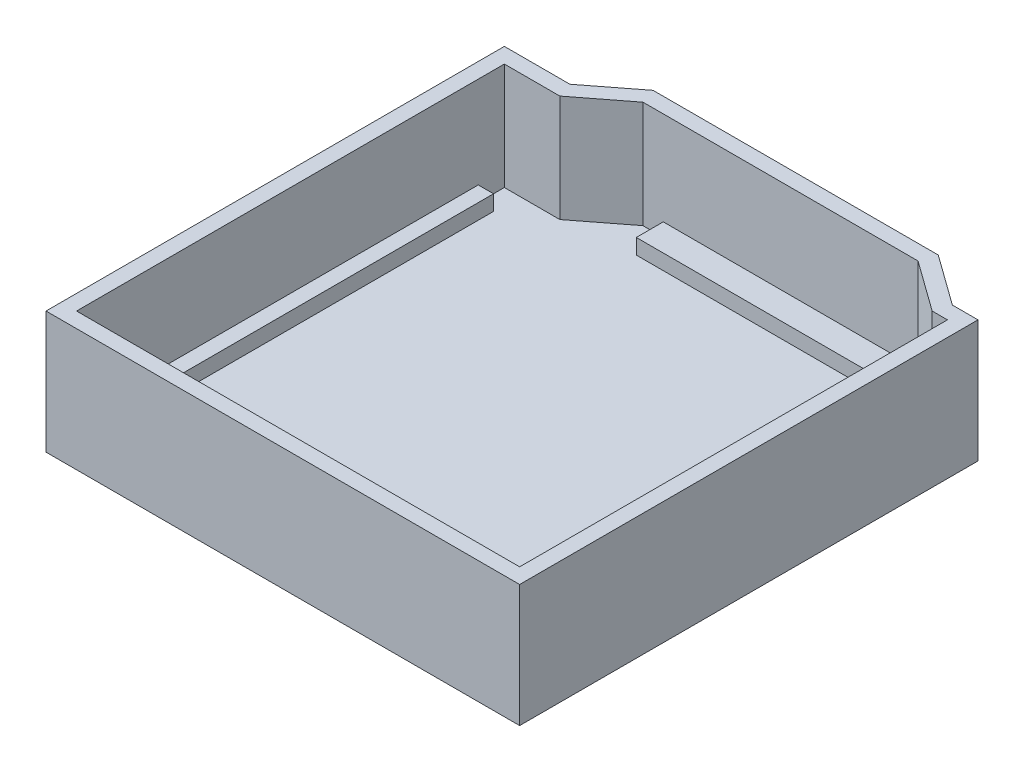
ISO-10303-21;
HEADER;
FILE_DESCRIPTION(('STEP AP214'),'2;1');
FILE_NAME('part.step','',(''),(''),'','','');
FILE_SCHEMA(('AUTOMOTIVE_DESIGN { 1 0 10303 214 1 1 1 1 }'));
ENDSEC;
DATA;
#1=APPLICATION_CONTEXT('core data for automotive mechanical design processes');
#2=APPLICATION_PROTOCOL_DEFINITION('international standard','automotive_design',2000,#1);
#3=PRODUCT_CONTEXT('',#1,'mechanical');
#4=PRODUCT('Part','Part','',(#3));
#5=PRODUCT_RELATED_PRODUCT_CATEGORY('part','',(#4));
#6=PRODUCT_DEFINITION_FORMATION('','',#4);
#7=PRODUCT_DEFINITION_CONTEXT('part definition',#1,'design');
#8=PRODUCT_DEFINITION('design','',#6,#7);
#9=PRODUCT_DEFINITION_SHAPE('','',#8);
#10=(LENGTH_UNIT() NAMED_UNIT(*) SI_UNIT(.MILLI.,.METRE.));
#11=(NAMED_UNIT(*) PLANE_ANGLE_UNIT() SI_UNIT($,.RADIAN.));
#12=(NAMED_UNIT(*) SI_UNIT($,.STERADIAN.) SOLID_ANGLE_UNIT());
#13=UNCERTAINTY_MEASURE_WITH_UNIT(LENGTH_MEASURE(1.E-05),#10,'distance_accuracy_value','');
#14=(GEOMETRIC_REPRESENTATION_CONTEXT(3) GLOBAL_UNCERTAINTY_ASSIGNED_CONTEXT((#13)) GLOBAL_UNIT_ASSIGNED_CONTEXT((#10,
#11,#12)) REPRESENTATION_CONTEXT('',''));
#15=CARTESIAN_POINT('',(0.,0.,0.));
#16=DIRECTION('',(0.,0.,1.));
#17=DIRECTION('',(1.,0.,0.));
#18=AXIS2_PLACEMENT_3D('',#15,#16,#17);
#19=CARTESIAN_POINT('',(0.,0.,0.));
#20=DIRECTION('',(0.,1.,0.));
#21=DIRECTION('',(0.,0.,1.));
#22=AXIS2_PLACEMENT_3D('',#19,#20,#21);
#23=PLANE('',#22);
#24=DIRECTION('',(0.,0.,-1.));
#25=VECTOR('',#24,1.);
#26=CARTESIAN_POINT('',(2.,0.,-52.5835309196684));
#27=LINE('',#26,#25);
#28=CARTESIAN_POINT('',(2.,0.,-2.58353091966845));
#29=VERTEX_POINT('',#28);
#30=CARTESIAN_POINT('',(2.,0.,-52.5835309196684));
#31=VERTEX_POINT('',#30);
#32=EDGE_CURVE('E318',#29,#31,#27,.T.);
#33=ORIENTED_EDGE('',*,*,#32,.F.);
#34=DIRECTION('',(1.,0.,0.));
#35=VECTOR('',#34,1.);
#36=CARTESIAN_POINT('',(0.,0.,-2.58353091966845));
#37=LINE('',#36,#35);
#38=CARTESIAN_POINT('',(0.,0.,-2.58353091966845));
#39=VERTEX_POINT('',#38);
#40=EDGE_CURVE('E300',#39,#29,#37,.T.);
#41=ORIENTED_EDGE('',*,*,#40,.F.);
#42=DIRECTION('',(0.,0.,1.));
#43=VECTOR('',#42,1.);
#44=CARTESIAN_POINT('',(0.,0.,0.));
#45=LINE('',#44,#43);
#46=CARTESIAN_POINT('',(0.,0.,0.));
#47=VERTEX_POINT('',#46);
#48=EDGE_CURVE('E386',#39,#47,#45,.T.);
#49=ORIENTED_EDGE('',*,*,#48,.T.);
#50=DIRECTION('',(1.,0.,0.));
#51=VECTOR('',#50,1.);
#52=CARTESIAN_POINT('',(0.,0.,0.));
#53=LINE('',#52,#51);
#54=CARTESIAN_POINT('',(58.,0.,0.));
#55=VERTEX_POINT('',#54);
#56=EDGE_CURVE('E337',#47,#55,#53,.T.);
#57=ORIENTED_EDGE('',*,*,#56,.T.);
#58=DIRECTION('',(0.,0.,-1.));
#59=VECTOR('',#58,1.);
#60=CARTESIAN_POINT('',(58.,0.,0.));
#61=LINE('',#60,#59);
#62=CARTESIAN_POINT('',(58.,0.,-56.));
#63=VERTEX_POINT('',#62);
#64=EDGE_CURVE('E368',#55,#63,#61,.T.);
#65=ORIENTED_EDGE('',*,*,#64,.T.);
#66=DIRECTION('',(-1.,0.,0.));
#67=VECTOR('',#66,1.);
#68=CARTESIAN_POINT('',(58.,0.,-56.));
#69=LINE('',#68,#67);
#70=CARTESIAN_POINT('',(56.,0.,-56.));
#71=VERTEX_POINT('',#70);
#72=EDGE_CURVE('E371',#63,#71,#69,.T.);
#73=ORIENTED_EDGE('',*,*,#72,.T.);
#74=DIRECTION('',(-0.811665069362016,0.,-0.584123116455386));
#75=VECTOR('',#74,1.);
#76=CARTESIAN_POINT('',(56.,0.,-56.));
#77=LINE('',#76,#75);
#78=CARTESIAN_POINT('',(49.3993617057769,0.,-60.7502172466864));
#79=VERTEX_POINT('',#78);
#80=EDGE_CURVE('E374',#71,#79,#77,.T.);
#81=ORIENTED_EDGE('',*,*,#80,.T.);
#82=DIRECTION('',(-1.,0.,0.));
#83=VECTOR('',#82,1.);
#84=CARTESIAN_POINT('',(13.3993617057769,0.,-60.7502172466864));
#85=LINE('',#84,#83);
#86=CARTESIAN_POINT('',(13.3993617057769,0.,-60.7502172466864));
#87=VERTEX_POINT('',#86);
#88=EDGE_CURVE('E377',#79,#87,#85,.T.);
#89=ORIENTED_EDGE('',*,*,#88,.T.);
#90=DIRECTION('',(-0.790872388544756,0.,0.611981098594976));
#91=VECTOR('',#90,1.);
#92=CARTESIAN_POINT('',(7.26058443206945,0.,-56.));
#93=LINE('',#92,#91);
#94=CARTESIAN_POINT('',(7.26058443206945,0.,-56.));
#95=VERTEX_POINT('',#94);
#96=EDGE_CURVE('E380',#87,#95,#93,.T.);
#97=ORIENTED_EDGE('',*,*,#96,.T.);
#98=DIRECTION('',(-1.,0.,0.));
#99=VECTOR('',#98,1.);
#100=CARTESIAN_POINT('',(0.,0.,-56.));
#101=LINE('',#100,#99);
#102=CARTESIAN_POINT('',(0.,0.,-56.));
#103=VERTEX_POINT('',#102);
#104=EDGE_CURVE('E383',#95,#103,#101,.T.);
#105=ORIENTED_EDGE('',*,*,#104,.T.);
#106=CARTESIAN_POINT('',(0.,0.,-52.5835309196685));
#107=VERTEX_POINT('',#106);
#108=EDGE_CURVE('E342',#103,#107,#45,.T.);
#109=ORIENTED_EDGE('',*,*,#108,.T.);
#110=DIRECTION('',(-1.,0.,0.));
#111=VECTOR('',#110,1.);
#112=CARTESIAN_POINT('',(0.,0.,-52.5835309196685));
#113=LINE('',#112,#111);
#114=EDGE_CURVE('E306',#31,#107,#113,.T.);
#115=ORIENTED_EDGE('',*,*,#114,.F.);
#116=EDGE_LOOP('',(#33,#41,#49,#57,#65,#73,#81,#89,#97,#105,#109,#115));
#117=FACE_BOUND('',#116,.T.);
#118=DIRECTION('',(-1.,0.,0.));
#119=VECTOR('',#118,1.);
#120=CARTESIAN_POINT('',(57.8762424768267,0.,-52.5835309196685));
#121=LINE('',#120,#119);
#122=CARTESIAN_POINT('',(57.8762424768267,0.,-52.5835309196685));
#123=VERTEX_POINT('',#122);
#124=CARTESIAN_POINT('',(56.061719763789,0.,-52.5835309196685));
#125=VERTEX_POINT('',#124);
#126=EDGE_CURVE('E261',#123,#125,#121,.T.);
#127=ORIENTED_EDGE('',*,*,#126,.F.);
#128=DIRECTION('',(0.,0.,-1.));
#129=VECTOR('',#128,1.);
#130=CARTESIAN_POINT('',(57.8762424768267,0.,-52.5835309196685));
#131=LINE('',#130,#129);
#132=CARTESIAN_POINT('',(57.8762424768267,0.,-2.58353091966845));
#133=VERTEX_POINT('',#132);
#134=EDGE_CURVE('E256',#133,#123,#131,.T.);
#135=ORIENTED_EDGE('',*,*,#134,.F.);
#136=DIRECTION('',(1.,0.,0.));
#137=VECTOR('',#136,1.);
#138=CARTESIAN_POINT('',(57.8762424768267,0.,-2.58353091966845));
#139=LINE('',#138,#137);
#140=CARTESIAN_POINT('',(56.061719763789,0.,-2.58353091966845));
#141=VERTEX_POINT('',#140);
#142=EDGE_CURVE('E271',#141,#133,#139,.T.);
#143=ORIENTED_EDGE('',*,*,#142,.F.);
#144=DIRECTION('',(0.,0.,1.));
#145=VECTOR('',#144,1.);
#146=CARTESIAN_POINT('',(56.061719763789,0.,-52.5835309196685));
#147=LINE('',#146,#145);
#148=EDGE_CURVE('E283',#125,#141,#147,.T.);
#149=ORIENTED_EDGE('',*,*,#148,.F.);
#150=EDGE_LOOP('',(#127,#135,#143,#149));
#151=FACE_BOUND('',#150,.T.);
#152=DIRECTION('',(1.,0.,0.));
#153=VECTOR('',#152,1.);
#154=CARTESIAN_POINT('',(16.2938215085871,0.,-56.9762594390906));
#155=LINE('',#154,#153);
#156=CARTESIAN_POINT('',(16.2938215085871,0.,-56.9762594390906));
#157=VERTEX_POINT('',#156);
#158=CARTESIAN_POINT('',(47.311437609835,0.,-56.9762594390906));
#159=VERTEX_POINT('',#158);
#160=EDGE_CURVE('E805',#157,#159,#155,.T.);
#161=ORIENTED_EDGE('',*,*,#160,.F.);
#162=DIRECTION('',(0.,0.,1.));
#163=VECTOR('',#162,1.);
#164=CARTESIAN_POINT('',(16.2938215085871,0.,-60.5067198083384));
#165=LINE('',#164,#163);
#166=CARTESIAN_POINT('',(16.2938215085871,0.,-60.5067198083384));
#167=VERTEX_POINT('',#166);
#168=EDGE_CURVE('E253',#167,#157,#165,.T.);
#169=ORIENTED_EDGE('',*,*,#168,.F.);
#170=DIRECTION('',(-1.,0.,0.));
#171=VECTOR('',#170,1.);
#172=CARTESIAN_POINT('',(16.2938215085871,0.,-60.5067198083384));
#173=LINE('',#172,#171);
#174=CARTESIAN_POINT('',(47.311437609835,0.,-60.5067198083384));
#175=VERTEX_POINT('',#174);
#176=EDGE_CURVE('E249',#175,#167,#173,.T.);
#177=ORIENTED_EDGE('',*,*,#176,.F.);
#178=DIRECTION('',(0.,0.,-1.));
#179=VECTOR('',#178,1.);
#180=CARTESIAN_POINT('',(47.311437609835,0.,-60.5067198083384));
#181=LINE('',#180,#179);
#182=EDGE_CURVE('E801',#159,#175,#181,.T.);
#183=ORIENTED_EDGE('',*,*,#182,.F.);
#184=EDGE_LOOP('',(#161,#169,#177,#183));
#185=FACE_BOUND('',#184,.T.);
#186=ADVANCED_FACE('F39',(#117,#151,#185),#23,.T.);
#187=CARTESIAN_POINT('',(0.,14.,0.));
#188=DIRECTION('',(1.,0.,0.));
#189=DIRECTION('',(0.,0.,-1.));
#190=AXIS2_PLACEMENT_3D('',#187,#188,#189);
#191=PLANE('',#190);
#192=ORIENTED_EDGE('',*,*,#48,.F.);
#193=DIRECTION('',(0.,-1.,0.));
#194=VECTOR('',#193,1.);
#195=CARTESIAN_POINT('',(0.,2.,-2.58353091966845));
#196=LINE('',#195,#194);
#197=CARTESIAN_POINT('',(0.,2.,-2.58353091966845));
#198=VERTEX_POINT('',#197);
#199=EDGE_CURVE('E334',#198,#39,#196,.T.);
#200=ORIENTED_EDGE('',*,*,#199,.F.);
#201=DIRECTION('',(0.,0.,1.));
#202=VECTOR('',#201,1.);
#203=CARTESIAN_POINT('',(0.,2.,-52.5835309196685));
#204=LINE('',#203,#202);
#205=CARTESIAN_POINT('',(0.,2.,-52.5835309196685));
#206=VERTEX_POINT('',#205);
#207=EDGE_CURVE('E301',#206,#198,#204,.T.);
#208=ORIENTED_EDGE('',*,*,#207,.F.);
#209=DIRECTION('',(0.,-1.,0.));
#210=VECTOR('',#209,1.);
#211=CARTESIAN_POINT('',(0.,2.,-52.5835309196685));
#212=LINE('',#211,#210);
#213=EDGE_CURVE('E315',#206,#107,#212,.T.);
#214=ORIENTED_EDGE('',*,*,#213,.T.);
#215=ORIENTED_EDGE('',*,*,#108,.F.);
#216=DIRECTION('',(0.,-1.,0.));
#217=VECTOR('',#216,1.);
#218=CARTESIAN_POINT('',(0.,14.,-56.));
#219=LINE('',#218,#217);
#220=CARTESIAN_POINT('',(0.,14.,-56.));
#221=VERTEX_POINT('',#220);
#222=EDGE_CURVE('E393',#221,#103,#219,.T.);
#223=ORIENTED_EDGE('',*,*,#222,.F.);
#224=DIRECTION('',(0.,0.,1.));
#225=VECTOR('',#224,1.);
#226=CARTESIAN_POINT('',(0.,14.,0.));
#227=LINE('',#226,#225);
#228=CARTESIAN_POINT('',(0.,14.,0.));
#229=VERTEX_POINT('',#228);
#230=EDGE_CURVE('E361',#221,#229,#227,.T.);
#231=ORIENTED_EDGE('',*,*,#230,.T.);
#232=DIRECTION('',(0.,-1.,0.));
#233=VECTOR('',#232,1.);
#234=CARTESIAN_POINT('',(0.,14.,0.));
#235=LINE('',#234,#233);
#236=EDGE_CURVE('E364',#229,#47,#235,.T.);
#237=ORIENTED_EDGE('',*,*,#236,.T.);
#238=EDGE_LOOP('',(#192,#200,#208,#214,#215,#223,#231,#237));
#239=FACE_BOUND('',#238,.T.);
#240=ADVANCED_FACE('F547',(#239),#191,.T.);
#241=CARTESIAN_POINT('',(0.,14.,2.));
#242=DIRECTION('',(0.,0.,-1.));
#243=DIRECTION('',(-1.,0.,0.));
#244=AXIS2_PLACEMENT_3D('',#241,#242,#243);
#245=PLANE('',#244);
#246=DIRECTION('',(1.,0.,0.));
#247=VECTOR('',#246,1.);
#248=CARTESIAN_POINT('',(0.,-2.,2.));
#249=LINE('',#248,#247);
#250=CARTESIAN_POINT('',(-2.,-2.,2.));
#251=VERTEX_POINT('',#250);
#252=CARTESIAN_POINT('',(60.,-2.,2.));
#253=VERTEX_POINT('',#252);
#254=EDGE_CURVE('E421',#251,#253,#249,.T.);
#255=ORIENTED_EDGE('',*,*,#254,.T.);
#256=DIRECTION('',(0.,-1.,0.));
#257=VECTOR('',#256,1.);
#258=CARTESIAN_POINT('',(60.,14.,2.));
#259=LINE('',#258,#257);
#260=CARTESIAN_POINT('',(60.,14.,2.));
#261=VERTEX_POINT('',#260);
#262=EDGE_CURVE('E11',#261,#253,#259,.T.);
#263=ORIENTED_EDGE('',*,*,#262,.F.);
#264=DIRECTION('',(1.,0.,0.));
#265=VECTOR('',#264,1.);
#266=CARTESIAN_POINT('',(0.,14.,2.));
#267=LINE('',#266,#265);
#268=CARTESIAN_POINT('',(-2.,14.,2.));
#269=VERTEX_POINT('',#268);
#270=EDGE_CURVE('E473',#269,#261,#267,.T.);
#271=ORIENTED_EDGE('',*,*,#270,.F.);
#272=DIRECTION('',(0.,-1.,0.));
#273=VECTOR('',#272,1.);
#274=CARTESIAN_POINT('',(-2.,14.,2.));
#275=LINE('',#274,#273);
#276=EDGE_CURVE('E426',#269,#251,#275,.T.);
#277=ORIENTED_EDGE('',*,*,#276,.T.);
#278=EDGE_LOOP('',(#255,#263,#271,#277));
#279=FACE_BOUND('',#278,.T.);
#280=ADVANCED_FACE('F507',(#279),#245,.F.);
#281=CARTESIAN_POINT('',(60.,14.,0.));
#282=DIRECTION('',(-1.,0.,0.));
#283=DIRECTION('',(0.,0.,1.));
#284=AXIS2_PLACEMENT_3D('',#281,#282,#283);
#285=PLANE('',#284);
#286=DIRECTION('',(0.,0.,-1.));
#287=VECTOR('',#286,1.);
#288=CARTESIAN_POINT('',(60.,-2.,0.));
#289=LINE('',#288,#287);
#290=CARTESIAN_POINT('',(60.,-2.,-58.));
#291=VERTEX_POINT('',#290);
#292=EDGE_CURVE('E424',#253,#291,#289,.T.);
#293=ORIENTED_EDGE('',*,*,#292,.T.);
#294=DIRECTION('',(0.,-1.,0.));
#295=VECTOR('',#294,1.);
#296=CARTESIAN_POINT('',(60.,14.,-58.));
#297=LINE('',#296,#295);
#298=CARTESIAN_POINT('',(60.,14.,-58.));
#299=VERTEX_POINT('',#298);
#300=EDGE_CURVE('E49',#299,#291,#297,.T.);
#301=ORIENTED_EDGE('',*,*,#300,.F.);
#302=DIRECTION('',(0.,0.,-1.));
#303=VECTOR('',#302,1.);
#304=CARTESIAN_POINT('',(60.,14.,0.));
#305=LINE('',#304,#303);
#306=EDGE_CURVE('E477',#261,#299,#305,.T.);
#307=ORIENTED_EDGE('',*,*,#306,.F.);
#308=ORIENTED_EDGE('',*,*,#262,.T.);
#309=EDGE_LOOP('',(#293,#301,#307,#308));
#310=FACE_BOUND('',#309,.T.);
#311=ADVANCED_FACE('F509',(#310),#285,.F.);
#312=CARTESIAN_POINT('',(58.,14.,-58.));
#313=DIRECTION('',(0.,0.,1.));
#314=DIRECTION('',(1.,0.,0.));
#315=AXIS2_PLACEMENT_3D('',#312,#313,#314);
#316=PLANE('',#315);
#317=DIRECTION('',(-1.,0.,0.));
#318=VECTOR('',#317,1.);
#319=CARTESIAN_POINT('',(58.,-2.,-58.));
#320=LINE('',#319,#318);
#321=CARTESIAN_POINT('',(56.6448466952681,-2.,-58.));
#322=VERTEX_POINT('',#321);
#323=EDGE_CURVE('E433',#291,#322,#320,.T.);
#324=ORIENTED_EDGE('',*,*,#323,.T.);
#325=DIRECTION('',(0.,-1.,0.));
#326=VECTOR('',#325,1.);
#327=CARTESIAN_POINT('',(56.6448466952681,14.,-58.));
#328=LINE('',#327,#326);
#329=CARTESIAN_POINT('',(56.6448466952681,14.,-58.));
#330=VERTEX_POINT('',#329);
#331=EDGE_CURVE('E437',#330,#322,#328,.T.);
#332=ORIENTED_EDGE('',*,*,#331,.F.);
#333=DIRECTION('',(-1.,0.,0.));
#334=VECTOR('',#333,1.);
#335=CARTESIAN_POINT('',(58.,14.,-58.));
#336=LINE('',#335,#334);
#337=EDGE_CURVE('E480',#299,#330,#336,.T.);
#338=ORIENTED_EDGE('',*,*,#337,.F.);
#339=ORIENTED_EDGE('',*,*,#300,.T.);
#340=EDGE_LOOP('',(#324,#332,#338,#339));
#341=FACE_BOUND('',#340,.T.);
#342=ADVANCED_FACE('F516',(#341),#316,.F.);
#343=CARTESIAN_POINT('',(57.1682462329108,14.,-57.623330138724));
#344=DIRECTION('',(-0.584123116455386,0.,0.811665069362017));
#345=DIRECTION('',(0.811665069362017,0.,0.584123116455386));
#346=AXIS2_PLACEMENT_3D('',#343,#344,#345);
#347=PLANE('',#346);
#348=DIRECTION('',(-0.811665069362017,0.,-0.584123116455386));
#349=VECTOR('',#348,1.);
#350=CARTESIAN_POINT('',(57.1682462329108,-2.,-57.623330138724));
#351=LINE('',#350,#349);
#352=CARTESIAN_POINT('',(50.044208401045,-2.,-62.7502172466864));
#353=VERTEX_POINT('',#352);
#354=EDGE_CURVE('E440',#322,#353,#351,.T.);
#355=ORIENTED_EDGE('',*,*,#354,.T.);
#356=DIRECTION('',(0.,-1.,0.));
#357=VECTOR('',#356,1.);
#358=CARTESIAN_POINT('',(50.044208401045,14.,-62.7502172466864));
#359=LINE('',#358,#357);
#360=CARTESIAN_POINT('',(50.044208401045,14.,-62.7502172466864));
#361=VERTEX_POINT('',#360);
#362=EDGE_CURVE('E444',#361,#353,#359,.T.);
#363=ORIENTED_EDGE('',*,*,#362,.F.);
#364=DIRECTION('',(-0.811665069362017,0.,-0.584123116455386));
#365=VECTOR('',#364,1.);
#366=CARTESIAN_POINT('',(57.1682462329108,14.,-57.623330138724));
#367=LINE('',#366,#365);
#368=EDGE_CURVE('E483',#330,#361,#367,.T.);
#369=ORIENTED_EDGE('',*,*,#368,.F.);
#370=ORIENTED_EDGE('',*,*,#331,.T.);
#371=EDGE_LOOP('',(#355,#363,#369,#370));
#372=FACE_BOUND('',#371,.T.);
#373=ADVANCED_FACE('F520',(#372),#347,.F.);
#374=CARTESIAN_POINT('',(13.3993617057769,14.,-62.7502172466864));
#375=DIRECTION('',(0.,0.,1.));
#376=DIRECTION('',(1.,0.,0.));
#377=AXIS2_PLACEMENT_3D('',#374,#375,#376);
#378=PLANE('',#377);
#379=DIRECTION('',(-1.,0.,0.));
#380=VECTOR('',#379,1.);
#381=CARTESIAN_POINT('',(13.3993617057769,-2.,-62.7502172466864));
#382=LINE('',#381,#380);
#383=CARTESIAN_POINT('',(12.715917030981,-2.,-62.7502172466864));
#384=VERTEX_POINT('',#383);
#385=EDGE_CURVE('E447',#353,#384,#382,.T.);
#386=ORIENTED_EDGE('',*,*,#385,.T.);
#387=DIRECTION('',(0.,-1.,0.));
#388=VECTOR('',#387,1.);
#389=CARTESIAN_POINT('',(12.715917030981,14.,-62.7502172466864));
#390=LINE('',#389,#388);
#391=CARTESIAN_POINT('',(12.715917030981,14.,-62.7502172466864));
#392=VERTEX_POINT('',#391);
#393=EDGE_CURVE('E451',#392,#384,#390,.T.);
#394=ORIENTED_EDGE('',*,*,#393,.F.);
#395=DIRECTION('',(-1.,0.,0.));
#396=VECTOR('',#395,1.);
#397=CARTESIAN_POINT('',(13.3993617057769,14.,-62.7502172466864));
#398=LINE('',#397,#396);
#399=EDGE_CURVE('E486',#361,#392,#398,.T.);
#400=ORIENTED_EDGE('',*,*,#399,.F.);
#401=ORIENTED_EDGE('',*,*,#362,.T.);
#402=EDGE_LOOP('',(#386,#394,#400,#401));
#403=FACE_BOUND('',#402,.T.);
#404=ADVANCED_FACE('F525',(#403),#378,.F.);
#405=CARTESIAN_POINT('',(6.0366222348795,14.,-57.5817447770895));
#406=DIRECTION('',(0.611981098594976,0.,0.790872388544755));
#407=DIRECTION('',(0.790872388544755,0.,-0.611981098594976));
#408=AXIS2_PLACEMENT_3D('',#405,#406,#407);
#409=PLANE('',#408);
#410=DIRECTION('',(-0.790872388544755,0.,0.611981098594976));
#411=VECTOR('',#410,1.);
#412=CARTESIAN_POINT('',(6.0366222348795,-2.,-57.5817447770895));
#413=LINE('',#412,#411);
#414=CARTESIAN_POINT('',(6.57713975727353,-2.,-58.));
#415=VERTEX_POINT('',#414);
#416=EDGE_CURVE('E454',#384,#415,#413,.T.);
#417=ORIENTED_EDGE('',*,*,#416,.T.);
#418=DIRECTION('',(0.,-1.,0.));
#419=VECTOR('',#418,1.);
#420=CARTESIAN_POINT('',(6.57713975727353,14.,-58.));
#421=LINE('',#420,#419);
#422=CARTESIAN_POINT('',(6.57713975727353,14.,-58.));
#423=VERTEX_POINT('',#422);
#424=EDGE_CURVE('E458',#423,#415,#421,.T.);
#425=ORIENTED_EDGE('',*,*,#424,.F.);
#426=DIRECTION('',(-0.790872388544755,0.,0.611981098594976));
#427=VECTOR('',#426,1.);
#428=CARTESIAN_POINT('',(6.0366222348795,14.,-57.5817447770895));
#429=LINE('',#428,#427);
#430=EDGE_CURVE('E489',#392,#423,#429,.T.);
#431=ORIENTED_EDGE('',*,*,#430,.F.);
#432=ORIENTED_EDGE('',*,*,#393,.T.);
#433=EDGE_LOOP('',(#417,#425,#431,#432));
#434=FACE_BOUND('',#433,.T.);
#435=ADVANCED_FACE('F529',(#434),#409,.F.);
#436=CARTESIAN_POINT('',(0.,14.,-58.));
#437=DIRECTION('',(0.,0.,1.));
#438=DIRECTION('',(1.,0.,0.));
#439=AXIS2_PLACEMENT_3D('',#436,#437,#438);
#440=PLANE('',#439);
#441=DIRECTION('',(-1.,0.,0.));
#442=VECTOR('',#441,1.);
#443=CARTESIAN_POINT('',(0.,-2.,-58.));
#444=LINE('',#443,#442);
#445=CARTESIAN_POINT('',(-2.,-2.,-58.));
#446=VERTEX_POINT('',#445);
#447=EDGE_CURVE('E461',#415,#446,#444,.T.);
#448=ORIENTED_EDGE('',*,*,#447,.T.);
#449=DIRECTION('',(0.,-1.,0.));
#450=VECTOR('',#449,1.);
#451=CARTESIAN_POINT('',(-2.,14.,-58.));
#452=LINE('',#451,#450);
#453=CARTESIAN_POINT('',(-2.,14.,-58.));
#454=VERTEX_POINT('',#453);
#455=EDGE_CURVE('E430',#454,#446,#452,.T.);
#456=ORIENTED_EDGE('',*,*,#455,.F.);
#457=DIRECTION('',(-1.,0.,0.));
#458=VECTOR('',#457,1.);
#459=CARTESIAN_POINT('',(0.,14.,-58.));
#460=LINE('',#459,#458);
#461=EDGE_CURVE('E491',#423,#454,#460,.T.);
#462=ORIENTED_EDGE('',*,*,#461,.F.);
#463=ORIENTED_EDGE('',*,*,#424,.T.);
#464=EDGE_LOOP('',(#448,#456,#462,#463));
#465=FACE_BOUND('',#464,.T.);
#466=ADVANCED_FACE('F533',(#465),#440,.F.);
#467=CARTESIAN_POINT('',(-2.,14.,0.));
#468=DIRECTION('',(1.,0.,0.));
#469=DIRECTION('',(0.,0.,-1.));
#470=AXIS2_PLACEMENT_3D('',#467,#468,#469);
#471=PLANE('',#470);
#472=DIRECTION('',(0.,0.,1.));
#473=VECTOR('',#472,1.);
#474=CARTESIAN_POINT('',(-2.,-2.,0.));
#475=LINE('',#474,#473);
#476=EDGE_CURVE('E467',#446,#251,#475,.T.);
#477=ORIENTED_EDGE('',*,*,#476,.T.);
#478=ORIENTED_EDGE('',*,*,#276,.F.);
#479=DIRECTION('',(0.,0.,1.));
#480=VECTOR('',#479,1.);
#481=CARTESIAN_POINT('',(-2.,14.,0.));
#482=LINE('',#481,#480);
#483=EDGE_CURVE('E43',#454,#269,#482,.T.);
#484=ORIENTED_EDGE('',*,*,#483,.F.);
#485=ORIENTED_EDGE('',*,*,#455,.T.);
#486=EDGE_LOOP('',(#477,#478,#484,#485));
#487=FACE_BOUND('',#486,.T.);
#488=ADVANCED_FACE('F503',(#487),#471,.F.);
#489=CARTESIAN_POINT('',(0.,14.,0.));
#490=DIRECTION('',(0.,1.,0.));
#491=DIRECTION('',(0.,0.,1.));
#492=AXIS2_PLACEMENT_3D('',#489,#490,#491);
#493=PLANE('',#492);
#494=DIRECTION('',(1.,0.,0.));
#495=VECTOR('',#494,1.);
#496=CARTESIAN_POINT('',(0.,14.,0.));
#497=LINE('',#496,#495);
#498=CARTESIAN_POINT('',(58.,14.,0.));
#499=VERTEX_POINT('',#498);
#500=EDGE_CURVE('E338',#229,#499,#497,.T.);
#501=ORIENTED_EDGE('',*,*,#500,.F.);
#502=ORIENTED_EDGE('',*,*,#230,.F.);
#503=DIRECTION('',(-1.,0.,0.));
#504=VECTOR('',#503,1.);
#505=CARTESIAN_POINT('',(0.,14.,-56.));
#506=LINE('',#505,#504);
#507=CARTESIAN_POINT('',(7.26058443206945,14.,-56.));
#508=VERTEX_POINT('',#507);
#509=EDGE_CURVE('E357',#508,#221,#506,.T.);
#510=ORIENTED_EDGE('',*,*,#509,.F.);
#511=DIRECTION('',(-0.790872388544756,0.,0.611981098594976));
#512=VECTOR('',#511,1.);
#513=CARTESIAN_POINT('',(7.26058443206945,14.,-56.));
#514=LINE('',#513,#512);
#515=CARTESIAN_POINT('',(13.3993617057769,14.,-60.7502172466864));
#516=VERTEX_POINT('',#515);
#517=EDGE_CURVE('E354',#516,#508,#514,.T.);
#518=ORIENTED_EDGE('',*,*,#517,.F.);
#519=DIRECTION('',(-1.,0.,0.));
#520=VECTOR('',#519,1.);
#521=CARTESIAN_POINT('',(13.3993617057769,14.,-60.7502172466864));
#522=LINE('',#521,#520);
#523=CARTESIAN_POINT('',(49.3993617057769,14.,-60.7502172466864));
#524=VERTEX_POINT('',#523);
#525=EDGE_CURVE('E351',#524,#516,#522,.T.);
#526=ORIENTED_EDGE('',*,*,#525,.F.);
#527=DIRECTION('',(-0.811665069362016,0.,-0.584123116455386));
#528=VECTOR('',#527,1.);
#529=CARTESIAN_POINT('',(56.,14.,-56.));
#530=LINE('',#529,#528);
#531=CARTESIAN_POINT('',(56.,14.,-56.));
#532=VERTEX_POINT('',#531);
#533=EDGE_CURVE('E348',#532,#524,#530,.T.);
#534=ORIENTED_EDGE('',*,*,#533,.F.);
#535=DIRECTION('',(-1.,0.,0.));
#536=VECTOR('',#535,1.);
#537=CARTESIAN_POINT('',(58.,14.,-56.));
#538=LINE('',#537,#536);
#539=CARTESIAN_POINT('',(58.,14.,-56.));
#540=VERTEX_POINT('',#539);
#541=EDGE_CURVE('E345',#540,#532,#538,.T.);
#542=ORIENTED_EDGE('',*,*,#541,.F.);
#543=DIRECTION('',(0.,0.,-1.));
#544=VECTOR('',#543,1.);
#545=CARTESIAN_POINT('',(58.,14.,0.));
#546=LINE('',#545,#544);
#547=EDGE_CURVE('E341',#499,#540,#546,.T.);
#548=ORIENTED_EDGE('',*,*,#547,.F.);
#549=EDGE_LOOP('',(#501,#502,#510,#518,#526,#534,#542,#548));
#550=FACE_BOUND('',#549,.T.);
#551=ORIENTED_EDGE('',*,*,#270,.T.);
#552=ORIENTED_EDGE('',*,*,#306,.T.);
#553=ORIENTED_EDGE('',*,*,#337,.T.);
#554=ORIENTED_EDGE('',*,*,#368,.T.);
#555=ORIENTED_EDGE('',*,*,#399,.T.);
#556=ORIENTED_EDGE('',*,*,#430,.T.);
#557=ORIENTED_EDGE('',*,*,#461,.T.);
#558=ORIENTED_EDGE('',*,*,#483,.T.);
#559=EDGE_LOOP('',(#551,#552,#553,#554,#555,#556,#557,#558));
#560=FACE_BOUND('',#559,.T.);
#561=ADVANCED_FACE('F499',(#550,#560),#493,.T.);
#562=CARTESIAN_POINT('',(0.,-2.,0.));
#563=DIRECTION('',(0.,1.,0.));
#564=DIRECTION('',(0.,0.,1.));
#565=AXIS2_PLACEMENT_3D('',#562,#563,#564);
#566=PLANE('',#565);
#567=ORIENTED_EDGE('',*,*,#254,.F.);
#568=ORIENTED_EDGE('',*,*,#476,.F.);
#569=ORIENTED_EDGE('',*,*,#447,.F.);
#570=ORIENTED_EDGE('',*,*,#416,.F.);
#571=ORIENTED_EDGE('',*,*,#385,.F.);
#572=ORIENTED_EDGE('',*,*,#354,.F.);
#573=ORIENTED_EDGE('',*,*,#323,.F.);
#574=ORIENTED_EDGE('',*,*,#292,.F.);
#575=EDGE_LOOP('',(#567,#568,#569,#570,#571,#572,#573,#574));
#576=FACE_BOUND('',#575,.T.);
#577=ADVANCED_FACE('F41',(#576),#566,.F.);
#578=CARTESIAN_POINT('',(0.,14.,0.));
#579=DIRECTION('',(0.,0.,-1.));
#580=DIRECTION('',(-1.,0.,0.));
#581=AXIS2_PLACEMENT_3D('',#578,#579,#580);
#582=PLANE('',#581);
#583=ORIENTED_EDGE('',*,*,#56,.F.);
#584=ORIENTED_EDGE('',*,*,#236,.F.);
#585=ORIENTED_EDGE('',*,*,#500,.T.);
#586=DIRECTION('',(0.,-1.,0.));
#587=VECTOR('',#586,1.);
#588=CARTESIAN_POINT('',(58.,14.,0.));
#589=LINE('',#588,#587);
#590=EDGE_CURVE('E417',#499,#55,#589,.T.);
#591=ORIENTED_EDGE('',*,*,#590,.T.);
#592=EDGE_LOOP('',(#583,#584,#585,#591));
#593=FACE_BOUND('',#592,.T.);
#594=ADVANCED_FACE('F536',(#593),#582,.T.);
#595=CARTESIAN_POINT('',(58.,14.,0.));
#596=DIRECTION('',(-1.,0.,0.));
#597=DIRECTION('',(0.,0.,1.));
#598=AXIS2_PLACEMENT_3D('',#595,#596,#597);
#599=PLANE('',#598);
#600=ORIENTED_EDGE('',*,*,#64,.F.);
#601=ORIENTED_EDGE('',*,*,#590,.F.);
#602=ORIENTED_EDGE('',*,*,#547,.T.);
#603=DIRECTION('',(0.,-1.,0.));
#604=VECTOR('',#603,1.);
#605=CARTESIAN_POINT('',(58.,14.,-56.));
#606=LINE('',#605,#604);
#607=EDGE_CURVE('E413',#540,#63,#606,.T.);
#608=ORIENTED_EDGE('',*,*,#607,.T.);
#609=EDGE_LOOP('',(#600,#601,#602,#608));
#610=FACE_BOUND('',#609,.T.);
#611=ADVANCED_FACE('F541',(#610),#599,.T.);
#612=CARTESIAN_POINT('',(58.,14.,-56.));
#613=DIRECTION('',(0.,0.,1.));
#614=DIRECTION('',(1.,0.,0.));
#615=AXIS2_PLACEMENT_3D('',#612,#613,#614);
#616=PLANE('',#615);
#617=ORIENTED_EDGE('',*,*,#72,.F.);
#618=ORIENTED_EDGE('',*,*,#607,.F.);
#619=ORIENTED_EDGE('',*,*,#541,.T.);
#620=DIRECTION('',(0.,-1.,0.));
#621=VECTOR('',#620,1.);
#622=CARTESIAN_POINT('',(56.,14.,-56.));
#623=LINE('',#622,#621);
#624=EDGE_CURVE('E409',#532,#71,#623,.T.);
#625=ORIENTED_EDGE('',*,*,#624,.T.);
#626=EDGE_LOOP('',(#617,#618,#619,#625));
#627=FACE_BOUND('',#626,.T.);
#628=ADVANCED_FACE('F576',(#627),#616,.T.);
#629=CARTESIAN_POINT('',(56.,14.,-56.));
#630=DIRECTION('',(-0.584123116455386,0.,0.811665069362017));
#631=DIRECTION('',(0.811665069362017,0.,0.584123116455386));
#632=AXIS2_PLACEMENT_3D('',#629,#630,#631);
#633=PLANE('',#632);
#634=ORIENTED_EDGE('',*,*,#80,.F.);
#635=ORIENTED_EDGE('',*,*,#624,.F.);
#636=ORIENTED_EDGE('',*,*,#533,.T.);
#637=DIRECTION('',(0.,-1.,0.));
#638=VECTOR('',#637,1.);
#639=CARTESIAN_POINT('',(49.3993617057769,14.,-60.7502172466864));
#640=LINE('',#639,#638);
#641=EDGE_CURVE('E405',#524,#79,#640,.T.);
#642=ORIENTED_EDGE('',*,*,#641,.T.);
#643=EDGE_LOOP('',(#634,#635,#636,#642));
#644=FACE_BOUND('',#643,.T.);
#645=ADVANCED_FACE('F572',(#644),#633,.T.);
#646=CARTESIAN_POINT('',(13.3993617057769,14.,-60.7502172466864));
#647=DIRECTION('',(0.,0.,1.));
#648=DIRECTION('',(1.,0.,0.));
#649=AXIS2_PLACEMENT_3D('',#646,#647,#648);
#650=PLANE('',#649);
#651=ORIENTED_EDGE('',*,*,#88,.F.);
#652=ORIENTED_EDGE('',*,*,#641,.F.);
#653=ORIENTED_EDGE('',*,*,#525,.T.);
#654=DIRECTION('',(0.,-1.,0.));
#655=VECTOR('',#654,1.);
#656=CARTESIAN_POINT('',(13.3993617057769,14.,-60.7502172466864));
#657=LINE('',#656,#655);
#658=EDGE_CURVE('E401',#516,#87,#657,.T.);
#659=ORIENTED_EDGE('',*,*,#658,.T.);
#660=EDGE_LOOP('',(#651,#652,#653,#659));
#661=FACE_BOUND('',#660,.T.);
#662=ADVANCED_FACE('F568',(#661),#650,.T.);
#663=CARTESIAN_POINT('',(7.26058443206945,14.,-56.));
#664=DIRECTION('',(0.611981098594976,0.,0.790872388544755));
#665=DIRECTION('',(0.790872388544755,0.,-0.611981098594976));
#666=AXIS2_PLACEMENT_3D('',#663,#664,#665);
#667=PLANE('',#666);
#668=ORIENTED_EDGE('',*,*,#96,.F.);
#669=ORIENTED_EDGE('',*,*,#658,.F.);
#670=ORIENTED_EDGE('',*,*,#517,.T.);
#671=DIRECTION('',(0.,-1.,0.));
#672=VECTOR('',#671,1.);
#673=CARTESIAN_POINT('',(7.26058443206945,14.,-56.));
#674=LINE('',#673,#672);
#675=EDGE_CURVE('E397',#508,#95,#674,.T.);
#676=ORIENTED_EDGE('',*,*,#675,.T.);
#677=EDGE_LOOP('',(#668,#669,#670,#676));
#678=FACE_BOUND('',#677,.T.);
#679=ADVANCED_FACE('F564',(#678),#667,.T.);
#680=CARTESIAN_POINT('',(0.,14.,-56.));
#681=DIRECTION('',(0.,0.,1.));
#682=DIRECTION('',(1.,0.,0.));
#683=AXIS2_PLACEMENT_3D('',#680,#681,#682);
#684=PLANE('',#683);
#685=ORIENTED_EDGE('',*,*,#104,.F.);
#686=ORIENTED_EDGE('',*,*,#675,.F.);
#687=ORIENTED_EDGE('',*,*,#509,.T.);
#688=ORIENTED_EDGE('',*,*,#222,.T.);
#689=EDGE_LOOP('',(#685,#686,#687,#688));
#690=FACE_BOUND('',#689,.T.);
#691=ADVANCED_FACE('F561',(#690),#684,.T.);
#692=CARTESIAN_POINT('',(0.,2.,-2.58353091966845));
#693=DIRECTION('',(0.,0.,-1.));
#694=DIRECTION('',(-1.,0.,0.));
#695=AXIS2_PLACEMENT_3D('',#692,#693,#694);
#696=PLANE('',#695);
#697=ORIENTED_EDGE('',*,*,#40,.T.);
#698=DIRECTION('',(0.,-1.,0.));
#699=VECTOR('',#698,1.);
#700=CARTESIAN_POINT('',(2.,2.,-2.58353091966845));
#701=LINE('',#700,#699);
#702=CARTESIAN_POINT('',(2.,2.,-2.58353091966845));
#703=VERTEX_POINT('',#702);
#704=EDGE_CURVE('E330',#703,#29,#701,.T.);
#705=ORIENTED_EDGE('',*,*,#704,.F.);
#706=DIRECTION('',(1.,0.,0.));
#707=VECTOR('',#706,1.);
#708=CARTESIAN_POINT('',(0.,2.,-2.58353091966845));
#709=LINE('',#708,#707);
#710=EDGE_CURVE('E305',#198,#703,#709,.T.);
#711=ORIENTED_EDGE('',*,*,#710,.F.);
#712=ORIENTED_EDGE('',*,*,#199,.T.);
#713=EDGE_LOOP('',(#697,#705,#711,#712));
#714=FACE_BOUND('',#713,.T.);
#715=ADVANCED_FACE('F558',(#714),#696,.F.);
#716=CARTESIAN_POINT('',(2.,2.,-52.5835309196684));
#717=DIRECTION('',(-1.,0.,0.));
#718=DIRECTION('',(0.,0.,1.));
#719=AXIS2_PLACEMENT_3D('',#716,#717,#718);
#720=PLANE('',#719);
#721=ORIENTED_EDGE('',*,*,#32,.T.);
#722=DIRECTION('',(0.,-1.,0.));
#723=VECTOR('',#722,1.);
#724=CARTESIAN_POINT('',(2.,2.,-52.5835309196684));
#725=LINE('',#724,#723);
#726=CARTESIAN_POINT('',(2.,2.,-52.5835309196684));
#727=VERTEX_POINT('',#726);
#728=EDGE_CURVE('E327',#727,#31,#725,.T.);
#729=ORIENTED_EDGE('',*,*,#728,.F.);
#730=DIRECTION('',(0.,0.,-1.));
#731=VECTOR('',#730,1.);
#732=CARTESIAN_POINT('',(2.,2.,-52.5835309196684));
#733=LINE('',#732,#731);
#734=EDGE_CURVE('E309',#703,#727,#733,.T.);
#735=ORIENTED_EDGE('',*,*,#734,.F.);
#736=ORIENTED_EDGE('',*,*,#704,.T.);
#737=EDGE_LOOP('',(#721,#729,#735,#736));
#738=FACE_BOUND('',#737,.T.);
#739=ADVANCED_FACE('F668',(#738),#720,.F.);
#740=CARTESIAN_POINT('',(0.,2.,-52.5835309196685));
#741=DIRECTION('',(0.,0.,1.));
#742=DIRECTION('',(1.,0.,0.));
#743=AXIS2_PLACEMENT_3D('',#740,#741,#742);
#744=PLANE('',#743);
#745=ORIENTED_EDGE('',*,*,#114,.T.);
#746=ORIENTED_EDGE('',*,*,#213,.F.);
#747=DIRECTION('',(-1.,0.,0.));
#748=VECTOR('',#747,1.);
#749=CARTESIAN_POINT('',(0.,2.,-52.5835309196685));
#750=LINE('',#749,#748);
#751=EDGE_CURVE('E312',#727,#206,#750,.T.);
#752=ORIENTED_EDGE('',*,*,#751,.F.);
#753=ORIENTED_EDGE('',*,*,#728,.T.);
#754=EDGE_LOOP('',(#745,#746,#752,#753));
#755=FACE_BOUND('',#754,.T.);
#756=ADVANCED_FACE('F677',(#755),#744,.F.);
#757=CARTESIAN_POINT('',(0.,2.,0.));
#758=DIRECTION('',(0.,1.,0.));
#759=DIRECTION('',(0.,0.,1.));
#760=AXIS2_PLACEMENT_3D('',#757,#758,#759);
#761=PLANE('',#760);
#762=ORIENTED_EDGE('',*,*,#207,.T.);
#763=ORIENTED_EDGE('',*,*,#710,.T.);
#764=ORIENTED_EDGE('',*,*,#734,.T.);
#765=ORIENTED_EDGE('',*,*,#751,.T.);
#766=EDGE_LOOP('',(#762,#763,#764,#765));
#767=FACE_BOUND('',#766,.T.);
#768=ADVANCED_FACE('F686',(#767),#761,.T.);
#769=CARTESIAN_POINT('',(57.8762424768267,2.,-52.5835309196685));
#770=DIRECTION('',(-1.,0.,0.));
#771=DIRECTION('',(0.,0.,1.));
#772=AXIS2_PLACEMENT_3D('',#769,#770,#771);
#773=PLANE('',#772);
#774=ORIENTED_EDGE('',*,*,#134,.T.);
#775=DIRECTION('',(0.,-1.,0.));
#776=VECTOR('',#775,1.);
#777=CARTESIAN_POINT('',(57.8762424768267,2.,-52.5835309196685));
#778=LINE('',#777,#776);
#779=CARTESIAN_POINT('',(57.8762424768267,2.,-52.5835309196685));
#780=VERTEX_POINT('',#779);
#781=EDGE_CURVE('E297',#780,#123,#778,.T.);
#782=ORIENTED_EDGE('',*,*,#781,.F.);
#783=DIRECTION('',(0.,0.,-1.));
#784=VECTOR('',#783,1.);
#785=CARTESIAN_POINT('',(57.8762424768267,2.,-52.5835309196685));
#786=LINE('',#785,#784);
#787=CARTESIAN_POINT('',(57.8762424768267,2.,-2.58353091966845));
#788=VERTEX_POINT('',#787);
#789=EDGE_CURVE('E266',#788,#780,#786,.T.);
#790=ORIENTED_EDGE('',*,*,#789,.F.);
#791=DIRECTION('',(0.,-1.,0.));
#792=VECTOR('',#791,1.);
#793=CARTESIAN_POINT('',(57.8762424768267,2.,-2.58353091966845));
#794=LINE('',#793,#792);
#795=EDGE_CURVE('E279',#788,#133,#794,.T.);
#796=ORIENTED_EDGE('',*,*,#795,.T.);
#797=EDGE_LOOP('',(#774,#782,#790,#796));
#798=FACE_BOUND('',#797,.T.);
#799=ADVANCED_FACE('F696',(#798),#773,.F.);
#800=CARTESIAN_POINT('',(57.8762424768267,2.,-52.5835309196685));
#801=DIRECTION('',(0.,0.,1.));
#802=DIRECTION('',(1.,0.,0.));
#803=AXIS2_PLACEMENT_3D('',#800,#801,#802);
#804=PLANE('',#803);
#805=ORIENTED_EDGE('',*,*,#126,.T.);
#806=DIRECTION('',(0.,-1.,0.));
#807=VECTOR('',#806,1.);
#808=CARTESIAN_POINT('',(56.061719763789,2.,-52.5835309196685));
#809=LINE('',#808,#807);
#810=CARTESIAN_POINT('',(56.061719763789,2.,-52.5835309196685));
#811=VERTEX_POINT('',#810);
#812=EDGE_CURVE('E293',#811,#125,#809,.T.);
#813=ORIENTED_EDGE('',*,*,#812,.F.);
#814=DIRECTION('',(-1.,0.,0.));
#815=VECTOR('',#814,1.);
#816=CARTESIAN_POINT('',(57.8762424768267,2.,-52.5835309196685));
#817=LINE('',#816,#815);
#818=EDGE_CURVE('E270',#780,#811,#817,.T.);
#819=ORIENTED_EDGE('',*,*,#818,.F.);
#820=ORIENTED_EDGE('',*,*,#781,.T.);
#821=EDGE_LOOP('',(#805,#813,#819,#820));
#822=FACE_BOUND('',#821,.T.);
#823=ADVANCED_FACE('F706',(#822),#804,.F.);
#824=CARTESIAN_POINT('',(56.061719763789,2.,-52.5835309196685));
#825=DIRECTION('',(1.,0.,0.));
#826=DIRECTION('',(0.,0.,-1.));
#827=AXIS2_PLACEMENT_3D('',#824,#825,#826);
#828=PLANE('',#827);
#829=ORIENTED_EDGE('',*,*,#148,.T.);
#830=DIRECTION('',(0.,-1.,0.));
#831=VECTOR('',#830,1.);
#832=CARTESIAN_POINT('',(56.061719763789,2.,-2.58353091966845));
#833=LINE('',#832,#831);
#834=CARTESIAN_POINT('',(56.061719763789,2.,-2.58353091966845));
#835=VERTEX_POINT('',#834);
#836=EDGE_CURVE('E65',#835,#141,#833,.T.);
#837=ORIENTED_EDGE('',*,*,#836,.F.);
#838=DIRECTION('',(0.,0.,1.));
#839=VECTOR('',#838,1.);
#840=CARTESIAN_POINT('',(56.061719763789,2.,-52.5835309196685));
#841=LINE('',#840,#839);
#842=EDGE_CURVE('E274',#811,#835,#841,.T.);
#843=ORIENTED_EDGE('',*,*,#842,.F.);
#844=ORIENTED_EDGE('',*,*,#812,.T.);
#845=EDGE_LOOP('',(#829,#837,#843,#844));
#846=FACE_BOUND('',#845,.T.);
#847=ADVANCED_FACE('F716',(#846),#828,.F.);
#848=CARTESIAN_POINT('',(57.8762424768267,2.,-2.58353091966845));
#849=DIRECTION('',(0.,0.,-1.));
#850=DIRECTION('',(-1.,0.,0.));
#851=AXIS2_PLACEMENT_3D('',#848,#849,#850);
#852=PLANE('',#851);
#853=ORIENTED_EDGE('',*,*,#142,.T.);
#854=ORIENTED_EDGE('',*,*,#795,.F.);
#855=DIRECTION('',(1.,0.,0.));
#856=VECTOR('',#855,1.);
#857=CARTESIAN_POINT('',(57.8762424768267,2.,-2.58353091966845));
#858=LINE('',#857,#856);
#859=EDGE_CURVE('E277',#835,#788,#858,.T.);
#860=ORIENTED_EDGE('',*,*,#859,.F.);
#861=ORIENTED_EDGE('',*,*,#836,.T.);
#862=EDGE_LOOP('',(#853,#854,#860,#861));
#863=FACE_BOUND('',#862,.T.);
#864=ADVANCED_FACE('F726',(#863),#852,.F.);
#865=CARTESIAN_POINT('',(0.,2.,0.));
#866=DIRECTION('',(0.,-1.,0.));
#867=DIRECTION('',(0.,0.,-1.));
#868=AXIS2_PLACEMENT_3D('',#865,#866,#867);
#869=PLANE('',#868);
#870=ORIENTED_EDGE('',*,*,#789,.T.);
#871=ORIENTED_EDGE('',*,*,#818,.T.);
#872=ORIENTED_EDGE('',*,*,#842,.T.);
#873=ORIENTED_EDGE('',*,*,#859,.T.);
#874=EDGE_LOOP('',(#870,#871,#872,#873));
#875=FACE_BOUND('',#874,.T.);
#876=ADVANCED_FACE('F736',(#875),#869,.F.);
#877=CARTESIAN_POINT('',(16.2938215085871,2.,-60.5067198083384));
#878=DIRECTION('',(1.,0.,0.));
#879=DIRECTION('',(0.,0.,-1.));
#880=AXIS2_PLACEMENT_3D('',#877,#878,#879);
#881=PLANE('',#880);
#882=ORIENTED_EDGE('',*,*,#168,.T.);
#883=DIRECTION('',(0.,-1.,0.));
#884=VECTOR('',#883,1.);
#885=CARTESIAN_POINT('',(16.2938215085871,2.,-56.9762594390906));
#886=LINE('',#885,#884);
#887=CARTESIAN_POINT('',(16.2938215085871,2.,-56.9762594390906));
#888=VERTEX_POINT('',#887);
#889=EDGE_CURVE('E232',#888,#157,#886,.T.);
#890=ORIENTED_EDGE('',*,*,#889,.F.);
#891=DIRECTION('',(0.,0.,1.));
#892=VECTOR('',#891,1.);
#893=CARTESIAN_POINT('',(16.2938215085871,2.,-60.5067198083384));
#894=LINE('',#893,#892);
#895=CARTESIAN_POINT('',(16.2938215085871,2.,-60.5067198083384));
#896=VERTEX_POINT('',#895);
#897=EDGE_CURVE('E240',#896,#888,#894,.T.);
#898=ORIENTED_EDGE('',*,*,#897,.F.);
#899=DIRECTION('',(0.,-1.,0.));
#900=VECTOR('',#899,1.);
#901=CARTESIAN_POINT('',(16.2938215085871,2.,-60.5067198083384));
#902=LINE('',#901,#900);
#903=EDGE_CURVE('E797',#896,#167,#902,.T.);
#904=ORIENTED_EDGE('',*,*,#903,.T.);
#905=EDGE_LOOP('',(#882,#890,#898,#904));
#906=FACE_BOUND('',#905,.T.);
#907=ADVANCED_FACE('F251',(#906),#881,.F.);
#908=CARTESIAN_POINT('',(16.2938215085871,2.,-56.9762594390906));
#909=DIRECTION('',(0.,0.,-1.));
#910=DIRECTION('',(-1.,0.,0.));
#911=AXIS2_PLACEMENT_3D('',#908,#909,#910);
#912=PLANE('',#911);
#913=ORIENTED_EDGE('',*,*,#160,.T.);
#914=DIRECTION('',(0.,-1.,0.));
#915=VECTOR('',#914,1.);
#916=CARTESIAN_POINT('',(47.311437609835,2.,-56.9762594390906));
#917=LINE('',#916,#915);
#918=CARTESIAN_POINT('',(47.311437609835,2.,-56.9762594390906));
#919=VERTEX_POINT('',#918);
#920=EDGE_CURVE('E235',#919,#159,#917,.T.);
#921=ORIENTED_EDGE('',*,*,#920,.F.);
#922=DIRECTION('',(1.,0.,0.));
#923=VECTOR('',#922,1.);
#924=CARTESIAN_POINT('',(16.2938215085871,2.,-56.9762594390906));
#925=LINE('',#924,#923);
#926=EDGE_CURVE('E228',#888,#919,#925,.T.);
#927=ORIENTED_EDGE('',*,*,#926,.F.);
#928=ORIENTED_EDGE('',*,*,#889,.T.);
#929=EDGE_LOOP('',(#913,#921,#927,#928));
#930=FACE_BOUND('',#929,.T.);
#931=ADVANCED_FACE('F230',(#930),#912,.F.);
#932=CARTESIAN_POINT('',(47.311437609835,2.,-60.5067198083384));
#933=DIRECTION('',(-1.,0.,0.));
#934=DIRECTION('',(0.,0.,1.));
#935=AXIS2_PLACEMENT_3D('',#932,#933,#934);
#936=PLANE('',#935);
#937=ORIENTED_EDGE('',*,*,#182,.T.);
#938=DIRECTION('',(0.,-1.,0.));
#939=VECTOR('',#938,1.);
#940=CARTESIAN_POINT('',(47.311437609835,2.,-60.5067198083384));
#941=LINE('',#940,#939);
#942=CARTESIAN_POINT('',(47.311437609835,2.,-60.5067198083384));
#943=VERTEX_POINT('',#942);
#944=EDGE_CURVE('E57',#943,#175,#941,.T.);
#945=ORIENTED_EDGE('',*,*,#944,.F.);
#946=DIRECTION('',(0.,0.,-1.));
#947=VECTOR('',#946,1.);
#948=CARTESIAN_POINT('',(47.311437609835,2.,-60.5067198083384));
#949=LINE('',#948,#947);
#950=EDGE_CURVE('E239',#919,#943,#949,.T.);
#951=ORIENTED_EDGE('',*,*,#950,.F.);
#952=ORIENTED_EDGE('',*,*,#920,.T.);
#953=EDGE_LOOP('',(#937,#945,#951,#952));
#954=FACE_BOUND('',#953,.T.);
#955=ADVANCED_FACE('F766',(#954),#936,.F.);
#956=CARTESIAN_POINT('',(16.2938215085871,2.,-60.5067198083384));
#957=DIRECTION('',(0.,0.,1.));
#958=DIRECTION('',(1.,0.,0.));
#959=AXIS2_PLACEMENT_3D('',#956,#957,#958);
#960=PLANE('',#959);
#961=ORIENTED_EDGE('',*,*,#176,.T.);
#962=ORIENTED_EDGE('',*,*,#903,.F.);
#963=DIRECTION('',(-1.,0.,0.));
#964=VECTOR('',#963,1.);
#965=CARTESIAN_POINT('',(16.2938215085871,2.,-60.5067198083384));
#966=LINE('',#965,#964);
#967=EDGE_CURVE('E244',#943,#896,#966,.T.);
#968=ORIENTED_EDGE('',*,*,#967,.F.);
#969=ORIENTED_EDGE('',*,*,#944,.T.);
#970=EDGE_LOOP('',(#961,#962,#968,#969));
#971=FACE_BOUND('',#970,.T.);
#972=ADVANCED_FACE('F775',(#971),#960,.F.);
#973=CARTESIAN_POINT('',(0.,2.,0.));
#974=DIRECTION('',(0.,1.,0.));
#975=DIRECTION('',(0.,0.,1.));
#976=AXIS2_PLACEMENT_3D('',#973,#974,#975);
#977=PLANE('',#976);
#978=ORIENTED_EDGE('',*,*,#897,.T.);
#979=ORIENTED_EDGE('',*,*,#926,.T.);
#980=ORIENTED_EDGE('',*,*,#950,.T.);
#981=ORIENTED_EDGE('',*,*,#967,.T.);
#982=EDGE_LOOP('',(#978,#979,#980,#981));
#983=FACE_BOUND('',#982,.T.);
#984=ADVANCED_FACE('F243',(#983),#977,.T.);
#985=CLOSED_SHELL('',(#186,#240,#280,#311,#342,#373,#404,#435,#466,#488,#561,#577,#594,#611,
#628,#645,#662,#679,#691,#715,#739,#756,#768,#799,#823,#847,#864,#876,#907,#931,#955,#972,#984));
#986=MANIFOLD_SOLID_BREP('B2',#985);
#987=ADVANCED_BREP_SHAPE_REPRESENTATION('',(#18,#986),#14);
#988=SHAPE_DEFINITION_REPRESENTATION(#9,#987);
ENDSEC;
END-ISO-10303-21;
